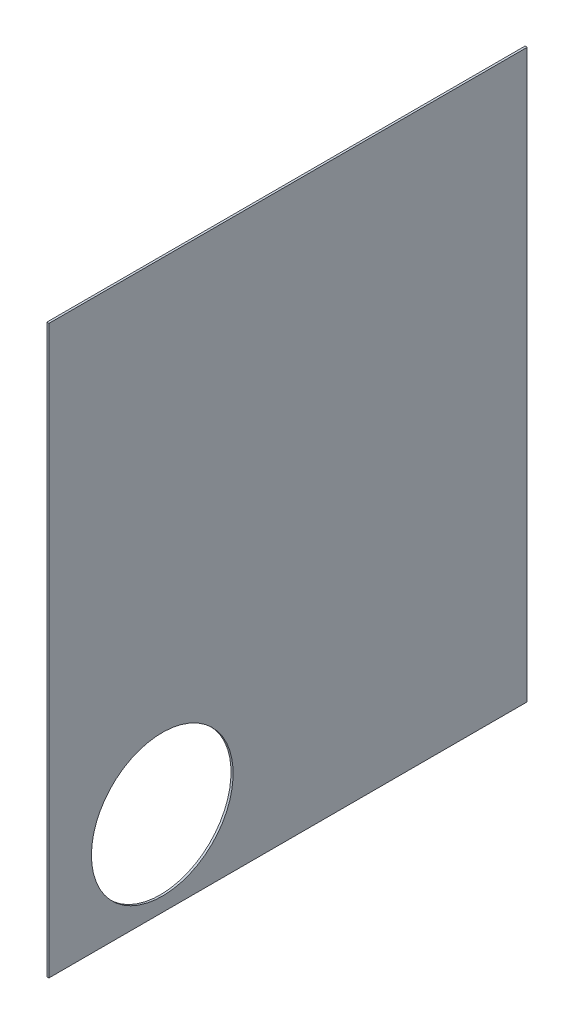
ISO-10303-21;
HEADER;
FILE_DESCRIPTION(('STEP AP214'),'2;1');
FILE_NAME('part.step','',(''),(''),'','','');
FILE_SCHEMA(('AUTOMOTIVE_DESIGN { 1 0 10303 214 1 1 1 1 }'));
ENDSEC;
DATA;
#1=APPLICATION_CONTEXT('core data for automotive mechanical design processes');
#2=APPLICATION_PROTOCOL_DEFINITION('international standard','automotive_design',2000,#1);
#3=PRODUCT_CONTEXT('',#1,'mechanical');
#4=PRODUCT('Part','Part','',(#3));
#5=PRODUCT_RELATED_PRODUCT_CATEGORY('part','',(#4));
#6=PRODUCT_DEFINITION_FORMATION('','',#4);
#7=PRODUCT_DEFINITION_CONTEXT('part definition',#1,'design');
#8=PRODUCT_DEFINITION('design','',#6,#7);
#9=PRODUCT_DEFINITION_SHAPE('','',#8);
#10=(LENGTH_UNIT() NAMED_UNIT(*) SI_UNIT(.MILLI.,.METRE.));
#11=(NAMED_UNIT(*) PLANE_ANGLE_UNIT() SI_UNIT($,.RADIAN.));
#12=(NAMED_UNIT(*) SI_UNIT($,.STERADIAN.) SOLID_ANGLE_UNIT());
#13=UNCERTAINTY_MEASURE_WITH_UNIT(LENGTH_MEASURE(1.E-05),#10,'distance_accuracy_value','');
#14=(GEOMETRIC_REPRESENTATION_CONTEXT(3) GLOBAL_UNCERTAINTY_ASSIGNED_CONTEXT((#13)) GLOBAL_UNIT_ASSIGNED_CONTEXT((#10,
#11,#12)) REPRESENTATION_CONTEXT('',''));
#15=CARTESIAN_POINT('',(0.,0.,0.));
#16=DIRECTION('',(0.,0.,1.));
#17=DIRECTION('',(1.,0.,0.));
#18=AXIS2_PLACEMENT_3D('',#15,#16,#17);
#19=CARTESIAN_POINT('',(-458.3,0.,0.));
#20=DIRECTION('',(-1.,0.,0.));
#21=DIRECTION('',(0.,0.,1.));
#22=AXIS2_PLACEMENT_3D('',#19,#20,#21);
#23=PLANE('',#22);
#24=CARTESIAN_POINT('',(-458.3,160.,745.));
#25=DIRECTION('',(-1.,0.,0.));
#26=DIRECTION('',(0.,0.,1.));
#27=AXIS2_PLACEMENT_3D('',#24,#25,#26);
#28=CIRCLE('',#27,50.);
#29=CARTESIAN_POINT('',(-458.3,160.,795.));
#30=VERTEX_POINT('',#29);
#31=EDGE_CURVE('E18',#30,#30,#28,.F.);
#32=ORIENTED_EDGE('',*,*,#31,.T.);
#33=EDGE_LOOP('',(#32));
#34=FACE_BOUND('',#33,.T.);
#35=DIRECTION('',(0.,1.,0.));
#36=VECTOR('',#35,1.);
#37=CARTESIAN_POINT('',(-458.3,100.,825.));
#38=LINE('',#37,#36);
#39=CARTESIAN_POINT('',(-458.3,500.,825.));
#40=VERTEX_POINT('',#39);
#41=CARTESIAN_POINT('',(-458.3,100.,825.));
#42=VERTEX_POINT('',#41);
#43=EDGE_CURVE('E65',#40,#42,#38,.F.);
#44=ORIENTED_EDGE('',*,*,#43,.F.);
#45=DIRECTION('',(0.,0.,1.));
#46=VECTOR('',#45,1.);
#47=CARTESIAN_POINT('',(-458.3,500.,825.));
#48=LINE('',#47,#46);
#49=CARTESIAN_POINT('',(-458.3,500.,487.5));
#50=VERTEX_POINT('',#49);
#51=EDGE_CURVE('E56',#50,#40,#48,.T.);
#52=ORIENTED_EDGE('',*,*,#51,.F.);
#53=DIRECTION('',(0.,1.,0.));
#54=VECTOR('',#53,1.);
#55=CARTESIAN_POINT('',(-458.3,500.,487.5));
#56=LINE('',#55,#54);
#57=CARTESIAN_POINT('',(-458.3,100.,487.5));
#58=VERTEX_POINT('',#57);
#59=EDGE_CURVE('E51',#58,#50,#56,.T.);
#60=ORIENTED_EDGE('',*,*,#59,.F.);
#61=DIRECTION('',(0.,0.,-1.));
#62=VECTOR('',#61,1.);
#63=CARTESIAN_POINT('',(-458.3,100.,487.5));
#64=LINE('',#63,#62);
#65=EDGE_CURVE('E68',#42,#58,#64,.T.);
#66=ORIENTED_EDGE('',*,*,#65,.F.);
#67=EDGE_LOOP('',(#44,#52,#60,#66));
#68=FACE_BOUND('',#67,.T.);
#69=ADVANCED_FACE('F15',(#34,#68),#23,.T.);
#70=CARTESIAN_POINT('',(-456.8,100.,825.));
#71=DIRECTION('',(0.,0.,1.));
#72=DIRECTION('',(1.,0.,0.));
#73=AXIS2_PLACEMENT_3D('',#70,#71,#72);
#74=PLANE('',#73);
#75=ORIENTED_EDGE('',*,*,#43,.T.);
#76=DIRECTION('',(1.,0.,0.));
#77=VECTOR('',#76,1.);
#78=CARTESIAN_POINT('',(-456.8,100.,825.));
#79=LINE('',#78,#77);
#80=CARTESIAN_POINT('',(-456.8,100.,825.));
#81=VERTEX_POINT('',#80);
#82=EDGE_CURVE('E80',#81,#42,#79,.F.);
#83=ORIENTED_EDGE('',*,*,#82,.F.);
#84=DIRECTION('',(0.,1.,0.));
#85=VECTOR('',#84,1.);
#86=CARTESIAN_POINT('',(-456.8,0.,825.));
#87=LINE('',#86,#85);
#88=CARTESIAN_POINT('',(-456.8,500.,825.));
#89=VERTEX_POINT('',#88);
#90=EDGE_CURVE('E75',#81,#89,#87,.T.);
#91=ORIENTED_EDGE('',*,*,#90,.T.);
#92=DIRECTION('',(1.,0.,0.));
#93=VECTOR('',#92,1.);
#94=CARTESIAN_POINT('',(-456.8,500.,825.));
#95=LINE('',#94,#93);
#96=EDGE_CURVE('E61',#40,#89,#95,.T.);
#97=ORIENTED_EDGE('',*,*,#96,.F.);
#98=EDGE_LOOP('',(#75,#83,#91,#97));
#99=FACE_BOUND('',#98,.T.);
#100=ADVANCED_FACE('F74',(#99),#74,.T.);
#101=CARTESIAN_POINT('',(-456.8,500.,825.));
#102=DIRECTION('',(0.,1.,0.));
#103=DIRECTION('',(0.,0.,1.));
#104=AXIS2_PLACEMENT_3D('',#101,#102,#103);
#105=PLANE('',#104);
#106=ORIENTED_EDGE('',*,*,#51,.T.);
#107=ORIENTED_EDGE('',*,*,#96,.T.);
#108=DIRECTION('',(0.,0.,1.));
#109=VECTOR('',#108,1.);
#110=CARTESIAN_POINT('',(-456.8,500.,0.));
#111=LINE('',#110,#109);
#112=CARTESIAN_POINT('',(-456.8,500.,487.5));
#113=VERTEX_POINT('',#112);
#114=EDGE_CURVE('E85',#89,#113,#111,.F.);
#115=ORIENTED_EDGE('',*,*,#114,.T.);
#116=DIRECTION('',(-1.,0.,0.));
#117=VECTOR('',#116,1.);
#118=CARTESIAN_POINT('',(-456.8,500.,487.5));
#119=LINE('',#118,#117);
#120=EDGE_CURVE('E63',#50,#113,#119,.F.);
#121=ORIENTED_EDGE('',*,*,#120,.F.);
#122=EDGE_LOOP('',(#106,#107,#115,#121));
#123=FACE_BOUND('',#122,.T.);
#124=ADVANCED_FACE('F58',(#123),#105,.T.);
#125=CARTESIAN_POINT('',(-456.8,500.,487.5));
#126=DIRECTION('',(0.,0.,-1.));
#127=DIRECTION('',(-1.,0.,0.));
#128=AXIS2_PLACEMENT_3D('',#125,#126,#127);
#129=PLANE('',#128);
#130=ORIENTED_EDGE('',*,*,#59,.T.);
#131=ORIENTED_EDGE('',*,*,#120,.T.);
#132=DIRECTION('',(0.,1.,0.));
#133=VECTOR('',#132,1.);
#134=CARTESIAN_POINT('',(-456.8,0.,487.5));
#135=LINE('',#134,#133);
#136=CARTESIAN_POINT('',(-456.8,100.,487.5));
#137=VERTEX_POINT('',#136);
#138=EDGE_CURVE('E87',#113,#137,#135,.F.);
#139=ORIENTED_EDGE('',*,*,#138,.T.);
#140=DIRECTION('',(1.,0.,0.));
#141=VECTOR('',#140,1.);
#142=CARTESIAN_POINT('',(-456.8,100.,487.5));
#143=LINE('',#142,#141);
#144=EDGE_CURVE('E32',#58,#137,#143,.T.);
#145=ORIENTED_EDGE('',*,*,#144,.F.);
#146=EDGE_LOOP('',(#130,#131,#139,#145));
#147=FACE_BOUND('',#146,.T.);
#148=ADVANCED_FACE('F94',(#147),#129,.T.);
#149=CARTESIAN_POINT('',(-456.8,100.,487.5));
#150=DIRECTION('',(0.,-1.,0.));
#151=DIRECTION('',(0.,0.,-1.));
#152=AXIS2_PLACEMENT_3D('',#149,#150,#151);
#153=PLANE('',#152);
#154=ORIENTED_EDGE('',*,*,#65,.T.);
#155=ORIENTED_EDGE('',*,*,#144,.T.);
#156=DIRECTION('',(0.,0.,1.));
#157=VECTOR('',#156,1.);
#158=CARTESIAN_POINT('',(-456.8,100.,0.));
#159=LINE('',#158,#157);
#160=EDGE_CURVE('E24',#137,#81,#159,.T.);
#161=ORIENTED_EDGE('',*,*,#160,.T.);
#162=ORIENTED_EDGE('',*,*,#82,.T.);
#163=EDGE_LOOP('',(#154,#155,#161,#162));
#164=FACE_BOUND('',#163,.T.);
#165=ADVANCED_FACE('F90',(#164),#153,.T.);
#166=CARTESIAN_POINT('',(-456.8,160.,745.));
#167=DIRECTION('',(-1.,0.,0.));
#168=DIRECTION('',(0.,0.,1.));
#169=AXIS2_PLACEMENT_3D('',#166,#167,#168);
#170=CYLINDRICAL_SURFACE('',#169,50.);
#171=ORIENTED_EDGE('',*,*,#31,.F.);
#172=EDGE_LOOP('',(#171));
#173=FACE_BOUND('',#172,.T.);
#174=CARTESIAN_POINT('',(-456.8,160.,745.));
#175=DIRECTION('',(-1.,0.,0.));
#176=DIRECTION('',(0.,0.,1.));
#177=AXIS2_PLACEMENT_3D('',#174,#175,#176);
#178=CIRCLE('',#177,50.);
#179=CARTESIAN_POINT('',(-456.8,160.,795.));
#180=VERTEX_POINT('',#179);
#181=EDGE_CURVE('E10',#180,#180,#178,.F.);
#182=ORIENTED_EDGE('',*,*,#181,.T.);
#183=EDGE_LOOP('',(#182));
#184=FACE_BOUND('',#183,.T.);
#185=ADVANCED_FACE('F102',(#173,#184),#170,.F.);
#186=CARTESIAN_POINT('',(-456.8,0.,0.));
#187=DIRECTION('',(-1.,0.,0.));
#188=DIRECTION('',(0.,0.,1.));
#189=AXIS2_PLACEMENT_3D('',#186,#187,#188);
#190=PLANE('',#189);
#191=ORIENTED_EDGE('',*,*,#181,.F.);
#192=EDGE_LOOP('',(#191));
#193=FACE_BOUND('',#192,.T.);
#194=ORIENTED_EDGE('',*,*,#138,.F.);
#195=ORIENTED_EDGE('',*,*,#114,.F.);
#196=ORIENTED_EDGE('',*,*,#90,.F.);
#197=ORIENTED_EDGE('',*,*,#160,.F.);
#198=EDGE_LOOP('',(#194,#195,#196,#197));
#199=FACE_BOUND('',#198,.T.);
#200=ADVANCED_FACE('F93',(#193,#199),#190,.F.);
#201=CLOSED_SHELL('',(#69,#100,#124,#148,#165,#185,#200));
#202=MANIFOLD_SOLID_BREP('B1',#201);
#203=ADVANCED_BREP_SHAPE_REPRESENTATION('',(#18,#202),#14);
#204=SHAPE_DEFINITION_REPRESENTATION(#9,#203);
ENDSEC;
END-ISO-10303-21;
